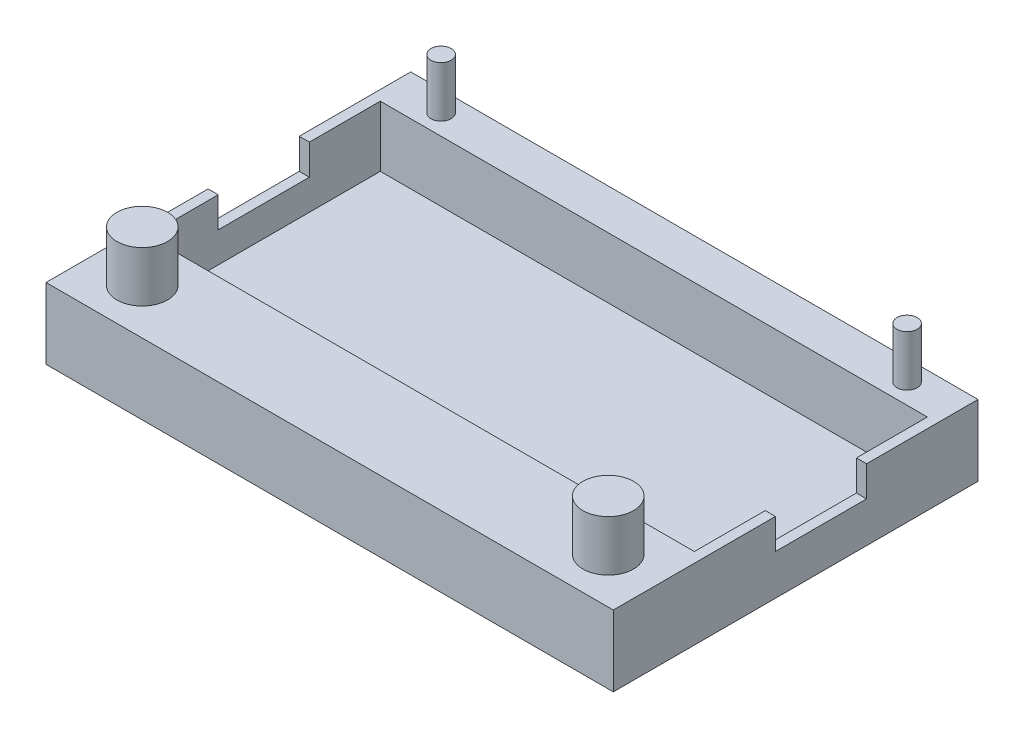
ISO-10303-21;
HEADER;
FILE_DESCRIPTION(('STEP AP214'),'2;1');
FILE_NAME('part.step','',(''),(''),'','','');
FILE_SCHEMA(('AUTOMOTIVE_DESIGN { 1 0 10303 214 1 1 1 1 }'));
ENDSEC;
DATA;
#1=APPLICATION_CONTEXT('core data for automotive mechanical design processes');
#2=APPLICATION_PROTOCOL_DEFINITION('international standard','automotive_design',2000,#1);
#3=PRODUCT_CONTEXT('',#1,'mechanical');
#4=PRODUCT('Part','Part','',(#3));
#5=PRODUCT_RELATED_PRODUCT_CATEGORY('part','',(#4));
#6=PRODUCT_DEFINITION_FORMATION('','',#4);
#7=PRODUCT_DEFINITION_CONTEXT('part definition',#1,'design');
#8=PRODUCT_DEFINITION('design','',#6,#7);
#9=PRODUCT_DEFINITION_SHAPE('','',#8);
#10=(LENGTH_UNIT() NAMED_UNIT(*) SI_UNIT(.MILLI.,.METRE.));
#11=(NAMED_UNIT(*) PLANE_ANGLE_UNIT() SI_UNIT($,.RADIAN.));
#12=(NAMED_UNIT(*) SI_UNIT($,.STERADIAN.) SOLID_ANGLE_UNIT());
#13=UNCERTAINTY_MEASURE_WITH_UNIT(LENGTH_MEASURE(1.E-05),#10,'distance_accuracy_value','');
#14=(GEOMETRIC_REPRESENTATION_CONTEXT(3) GLOBAL_UNCERTAINTY_ASSIGNED_CONTEXT((#13)) GLOBAL_UNIT_ASSIGNED_CONTEXT((#10,
#11,#12)) REPRESENTATION_CONTEXT('',''));
#15=CARTESIAN_POINT('',(0.,0.,0.));
#16=DIRECTION('',(0.,0.,1.));
#17=DIRECTION('',(1.,0.,0.));
#18=AXIS2_PLACEMENT_3D('',#15,#16,#17);
#19=CARTESIAN_POINT('',(0.,4.,0.));
#20=DIRECTION('',(0.,1.,0.));
#21=DIRECTION('',(0.,0.,1.));
#22=AXIS2_PLACEMENT_3D('',#19,#20,#21);
#23=PLANE('',#22);
#24=DIRECTION('',(0.,0.,-1.));
#25=VECTOR('',#24,1.);
#26=CARTESIAN_POINT('',(0.,4.,-32.));
#27=LINE('',#26,#25);
#28=CARTESIAN_POINT('',(0.,4.,-15.));
#29=VERTEX_POINT('',#28);
#30=CARTESIAN_POINT('',(0.,4.,-24.));
#31=VERTEX_POINT('',#30);
#32=EDGE_CURVE('E279',#29,#31,#27,.T.);
#33=ORIENTED_EDGE('',*,*,#32,.T.);
#34=DIRECTION('',(1.,0.,0.));
#35=VECTOR('',#34,1.);
#36=CARTESIAN_POINT('',(0.,4.,-24.));
#37=LINE('',#36,#35);
#38=CARTESIAN_POINT('',(-1.,4.,-24.));
#39=VERTEX_POINT('',#38);
#40=EDGE_CURVE('E196',#39,#31,#37,.T.);
#41=ORIENTED_EDGE('',*,*,#40,.F.);
#42=DIRECTION('',(0.,0.,-1.));
#43=VECTOR('',#42,1.);
#44=CARTESIAN_POINT('',(-1.,4.,-31.));
#45=LINE('',#44,#43);
#46=CARTESIAN_POINT('',(-1.,4.,-15.));
#47=VERTEX_POINT('',#46);
#48=EDGE_CURVE('E255',#47,#39,#45,.T.);
#49=ORIENTED_EDGE('',*,*,#48,.F.);
#50=DIRECTION('',(-1.,0.,0.));
#51=VECTOR('',#50,1.);
#52=CARTESIAN_POINT('',(0.,4.,-15.));
#53=LINE('',#52,#51);
#54=EDGE_CURVE('E64',#29,#47,#53,.T.);
#55=ORIENTED_EDGE('',*,*,#54,.F.);
#56=EDGE_LOOP('',(#33,#41,#49,#55));
#57=FACE_BOUND('',#56,.T.);
#58=ADVANCED_FACE('F41',(#57),#23,.T.);
#59=DIRECTION('',(0.,0.,1.));
#60=VECTOR('',#59,1.);
#61=CARTESIAN_POINT('',(-55.,4.,-31.));
#62=LINE('',#61,#60);
#63=CARTESIAN_POINT('',(-55.,4.,-24.));
#64=VERTEX_POINT('',#63);
#65=CARTESIAN_POINT('',(-55.,4.,-15.));
#66=VERTEX_POINT('',#65);
#67=EDGE_CURVE('E56',#64,#66,#62,.T.);
#68=ORIENTED_EDGE('',*,*,#67,.F.);
#69=DIRECTION('',(1.,0.,0.));
#70=VECTOR('',#69,1.);
#71=CARTESIAN_POINT('',(0.,4.,-24.));
#72=LINE('',#71,#70);
#73=CARTESIAN_POINT('',(-56.,4.,-24.));
#74=VERTEX_POINT('',#73);
#75=EDGE_CURVE('E201',#74,#64,#72,.T.);
#76=ORIENTED_EDGE('',*,*,#75,.F.);
#77=DIRECTION('',(0.,0.,1.));
#78=VECTOR('',#77,1.);
#79=CARTESIAN_POINT('',(-56.,4.,-32.));
#80=LINE('',#79,#78);
#81=CARTESIAN_POINT('',(-56.,4.,-15.));
#82=VERTEX_POINT('',#81);
#83=EDGE_CURVE('E277',#74,#82,#80,.T.);
#84=ORIENTED_EDGE('',*,*,#83,.T.);
#85=DIRECTION('',(-1.,0.,0.));
#86=VECTOR('',#85,1.);
#87=CARTESIAN_POINT('',(0.,4.,-15.));
#88=LINE('',#87,#86);
#89=EDGE_CURVE('E229',#66,#82,#88,.T.);
#90=ORIENTED_EDGE('',*,*,#89,.F.);
#91=EDGE_LOOP('',(#68,#76,#84,#90));
#92=FACE_BOUND('',#91,.T.);
#93=ADVANCED_FACE('F351',(#92),#23,.T.);
#94=CARTESIAN_POINT('',(-56.,1.,-32.));
#95=DIRECTION('',(1.,0.,0.));
#96=DIRECTION('',(0.,0.,-1.));
#97=AXIS2_PLACEMENT_3D('',#94,#95,#96);
#98=PLANE('',#97);
#99=DIRECTION('',(0.,0.,1.));
#100=VECTOR('',#99,1.);
#101=CARTESIAN_POINT('',(-56.,0.,-32.));
#102=LINE('',#101,#100);
#103=CARTESIAN_POINT('',(-56.,0.,-35.));
#104=VERTEX_POINT('',#103);
#105=CARTESIAN_POINT('',(-56.,0.,1.));
#106=VERTEX_POINT('',#105);
#107=EDGE_CURVE('E49',#104,#106,#102,.T.);
#108=ORIENTED_EDGE('',*,*,#107,.T.);
#109=DIRECTION('',(0.,-1.,0.));
#110=VECTOR('',#109,1.);
#111=CARTESIAN_POINT('',(-56.,7.,1.));
#112=LINE('',#111,#110);
#113=CARTESIAN_POINT('',(-56.,7.,1.));
#114=VERTEX_POINT('',#113);
#115=EDGE_CURVE('E174',#114,#106,#112,.T.);
#116=ORIENTED_EDGE('',*,*,#115,.F.);
#117=DIRECTION('',(0.,0.,-1.));
#118=VECTOR('',#117,1.);
#119=CARTESIAN_POINT('',(-56.,7.,0.));
#120=LINE('',#119,#118);
#121=CARTESIAN_POINT('',(-56.,7.,-15.));
#122=VERTEX_POINT('',#121);
#123=EDGE_CURVE('E156',#114,#122,#120,.T.);
#124=ORIENTED_EDGE('',*,*,#123,.T.);
#125=DIRECTION('',(0.,-1.,0.));
#126=VECTOR('',#125,1.);
#127=CARTESIAN_POINT('',(-56.,7.,-15.));
#128=LINE('',#127,#126);
#129=EDGE_CURVE('E168',#122,#82,#128,.T.);
#130=ORIENTED_EDGE('',*,*,#129,.T.);
#131=ORIENTED_EDGE('',*,*,#83,.F.);
#132=DIRECTION('',(0.,-1.,0.));
#133=VECTOR('',#132,1.);
#134=CARTESIAN_POINT('',(-56.,7.,-24.));
#135=LINE('',#134,#133);
#136=CARTESIAN_POINT('',(-56.,7.,-24.));
#137=VERTEX_POINT('',#136);
#138=EDGE_CURVE('E219',#137,#74,#135,.T.);
#139=ORIENTED_EDGE('',*,*,#138,.F.);
#140=DIRECTION('',(0.,0.,-1.));
#141=VECTOR('',#140,1.);
#142=CARTESIAN_POINT('',(-56.,7.,0.));
#143=LINE('',#142,#141);
#144=CARTESIAN_POINT('',(-56.,7.,-35.));
#145=VERTEX_POINT('',#144);
#146=EDGE_CURVE('E205',#137,#145,#143,.T.);
#147=ORIENTED_EDGE('',*,*,#146,.T.);
#148=DIRECTION('',(0.,-1.,0.));
#149=VECTOR('',#148,1.);
#150=CARTESIAN_POINT('',(-56.,7.,-35.));
#151=LINE('',#150,#149);
#152=EDGE_CURVE('E190',#145,#104,#151,.T.);
#153=ORIENTED_EDGE('',*,*,#152,.T.);
#154=EDGE_LOOP('',(#108,#116,#124,#130,#131,#139,#147,#153));
#155=FACE_BOUND('',#154,.T.);
#156=ADVANCED_FACE('F43',(#155),#98,.F.);
#157=CARTESIAN_POINT('',(0.,1.,-32.));
#158=DIRECTION('',(-1.,0.,0.));
#159=DIRECTION('',(0.,0.,1.));
#160=AXIS2_PLACEMENT_3D('',#157,#158,#159);
#161=PLANE('',#160);
#162=DIRECTION('',(0.,0.,-1.));
#163=VECTOR('',#162,1.);
#164=CARTESIAN_POINT('',(0.,0.,-32.));
#165=LINE('',#164,#163);
#166=CARTESIAN_POINT('',(0.,0.,1.));
#167=VERTEX_POINT('',#166);
#168=CARTESIAN_POINT('',(0.,0.,-35.));
#169=VERTEX_POINT('',#168);
#170=EDGE_CURVE('E11',#167,#169,#165,.T.);
#171=ORIENTED_EDGE('',*,*,#170,.T.);
#172=DIRECTION('',(0.,-1.,0.));
#173=VECTOR('',#172,1.);
#174=CARTESIAN_POINT('',(0.,7.,-35.));
#175=LINE('',#174,#173);
#176=CARTESIAN_POINT('',(0.,7.,-35.));
#177=VERTEX_POINT('',#176);
#178=EDGE_CURVE('E193',#177,#169,#175,.T.);
#179=ORIENTED_EDGE('',*,*,#178,.F.);
#180=DIRECTION('',(0.,0.,-1.));
#181=VECTOR('',#180,1.);
#182=CARTESIAN_POINT('',(0.,7.,0.));
#183=LINE('',#182,#181);
#184=CARTESIAN_POINT('',(0.,7.,-24.));
#185=VERTEX_POINT('',#184);
#186=EDGE_CURVE('E203',#185,#177,#183,.T.);
#187=ORIENTED_EDGE('',*,*,#186,.F.);
#188=DIRECTION('',(0.,-1.,0.));
#189=VECTOR('',#188,1.);
#190=CARTESIAN_POINT('',(0.,7.,-24.));
#191=LINE('',#190,#189);
#192=EDGE_CURVE('E221',#185,#31,#191,.T.);
#193=ORIENTED_EDGE('',*,*,#192,.T.);
#194=ORIENTED_EDGE('',*,*,#32,.F.);
#195=DIRECTION('',(0.,-1.,0.));
#196=VECTOR('',#195,1.);
#197=CARTESIAN_POINT('',(0.,7.,-15.));
#198=LINE('',#197,#196);
#199=CARTESIAN_POINT('',(0.,7.,-15.));
#200=VERTEX_POINT('',#199);
#201=EDGE_CURVE('E250',#200,#29,#198,.T.);
#202=ORIENTED_EDGE('',*,*,#201,.F.);
#203=DIRECTION('',(0.,0.,-1.));
#204=VECTOR('',#203,1.);
#205=CARTESIAN_POINT('',(0.,7.,0.));
#206=LINE('',#205,#204);
#207=CARTESIAN_POINT('',(0.,7.,1.));
#208=VERTEX_POINT('',#207);
#209=EDGE_CURVE('E226',#208,#200,#206,.T.);
#210=ORIENTED_EDGE('',*,*,#209,.F.);
#211=DIRECTION('',(0.,-1.,0.));
#212=VECTOR('',#211,1.);
#213=CARTESIAN_POINT('',(0.,7.,1.));
#214=LINE('',#213,#212);
#215=EDGE_CURVE('E176',#208,#167,#214,.T.);
#216=ORIENTED_EDGE('',*,*,#215,.T.);
#217=EDGE_LOOP('',(#171,#179,#187,#193,#194,#202,#210,#216));
#218=FACE_BOUND('',#217,.T.);
#219=ADVANCED_FACE('F283',(#218),#161,.F.);
#220=CARTESIAN_POINT('',(0.,0.,0.));
#221=DIRECTION('',(0.,1.,0.));
#222=DIRECTION('',(0.,0.,1.));
#223=AXIS2_PLACEMENT_3D('',#220,#221,#222);
#224=PLANE('',#223);
#225=ORIENTED_EDGE('',*,*,#107,.F.);
#226=DIRECTION('',(-1.,0.,0.));
#227=VECTOR('',#226,1.);
#228=CARTESIAN_POINT('',(-56.,0.,-35.));
#229=LINE('',#228,#227);
#230=EDGE_CURVE('E181',#169,#104,#229,.T.);
#231=ORIENTED_EDGE('',*,*,#230,.F.);
#232=ORIENTED_EDGE('',*,*,#170,.F.);
#233=DIRECTION('',(1.,0.,0.));
#234=VECTOR('',#233,1.);
#235=CARTESIAN_POINT('',(-56.,0.,1.));
#236=LINE('',#235,#234);
#237=EDGE_CURVE('E177',#106,#167,#236,.T.);
#238=ORIENTED_EDGE('',*,*,#237,.F.);
#239=EDGE_LOOP('',(#225,#231,#232,#238));
#240=FACE_BOUND('',#239,.T.);
#241=ADVANCED_FACE('F297',(#240),#224,.F.);
#242=CARTESIAN_POINT('',(-55.,4.,-31.));
#243=DIRECTION('',(1.,0.,0.));
#244=DIRECTION('',(0.,0.,-1.));
#245=AXIS2_PLACEMENT_3D('',#242,#243,#244);
#246=PLANE('',#245);
#247=DIRECTION('',(0.,0.,1.));
#248=VECTOR('',#247,1.);
#249=CARTESIAN_POINT('',(-55.,1.,-31.));
#250=LINE('',#249,#248);
#251=CARTESIAN_POINT('',(-55.,1.,-31.));
#252=VERTEX_POINT('',#251);
#253=CARTESIAN_POINT('',(-55.,1.,-8.));
#254=VERTEX_POINT('',#253);
#255=EDGE_CURVE('E253',#252,#254,#250,.T.);
#256=ORIENTED_EDGE('',*,*,#255,.F.);
#257=DIRECTION('',(0.,-1.,0.));
#258=VECTOR('',#257,1.);
#259=CARTESIAN_POINT('',(-55.,4.,-31.));
#260=LINE('',#259,#258);
#261=CARTESIAN_POINT('',(-55.,7.,-31.));
#262=VERTEX_POINT('',#261);
#263=EDGE_CURVE('E259',#262,#252,#260,.T.);
#264=ORIENTED_EDGE('',*,*,#263,.F.);
#265=DIRECTION('',(0.,0.,-1.));
#266=VECTOR('',#265,1.);
#267=CARTESIAN_POINT('',(-55.,7.,0.));
#268=LINE('',#267,#266);
#269=CARTESIAN_POINT('',(-55.,7.,-24.));
#270=VERTEX_POINT('',#269);
#271=EDGE_CURVE('E209',#270,#262,#268,.T.);
#272=ORIENTED_EDGE('',*,*,#271,.F.);
#273=DIRECTION('',(0.,-1.,0.));
#274=VECTOR('',#273,1.);
#275=CARTESIAN_POINT('',(-55.,7.,-24.));
#276=LINE('',#275,#274);
#277=EDGE_CURVE('E215',#270,#64,#276,.T.);
#278=ORIENTED_EDGE('',*,*,#277,.T.);
#279=ORIENTED_EDGE('',*,*,#67,.T.);
#280=DIRECTION('',(0.,-1.,0.));
#281=VECTOR('',#280,1.);
#282=CARTESIAN_POINT('',(-55.,7.,-15.));
#283=LINE('',#282,#281);
#284=CARTESIAN_POINT('',(-55.,7.,-15.));
#285=VERTEX_POINT('',#284);
#286=EDGE_CURVE('E244',#285,#66,#283,.T.);
#287=ORIENTED_EDGE('',*,*,#286,.F.);
#288=DIRECTION('',(0.,0.,-1.));
#289=VECTOR('',#288,1.);
#290=CARTESIAN_POINT('',(-55.,7.,0.));
#291=LINE('',#290,#289);
#292=CARTESIAN_POINT('',(-55.,7.,-8.));
#293=VERTEX_POINT('',#292);
#294=EDGE_CURVE('E237',#293,#285,#291,.T.);
#295=ORIENTED_EDGE('',*,*,#294,.F.);
#296=DIRECTION('',(0.,-1.,0.));
#297=VECTOR('',#296,1.);
#298=CARTESIAN_POINT('',(-55.,4.,-8.));
#299=LINE('',#298,#297);
#300=EDGE_CURVE('E274',#293,#254,#299,.T.);
#301=ORIENTED_EDGE('',*,*,#300,.T.);
#302=EDGE_LOOP('',(#256,#264,#272,#278,#279,#287,#295,#301));
#303=FACE_BOUND('',#302,.T.);
#304=ADVANCED_FACE('F359',(#303),#246,.T.);
#305=CARTESIAN_POINT('',(-55.,4.,-8.));
#306=DIRECTION('',(0.,0.,-1.));
#307=DIRECTION('',(-1.,0.,0.));
#308=AXIS2_PLACEMENT_3D('',#305,#306,#307);
#309=PLANE('',#308);
#310=DIRECTION('',(1.,0.,0.));
#311=VECTOR('',#310,1.);
#312=CARTESIAN_POINT('',(-55.,1.,-8.));
#313=LINE('',#312,#311);
#314=CARTESIAN_POINT('',(-1.,1.,-8.));
#315=VERTEX_POINT('',#314);
#316=EDGE_CURVE('E261',#254,#315,#313,.T.);
#317=ORIENTED_EDGE('',*,*,#316,.F.);
#318=ORIENTED_EDGE('',*,*,#300,.F.);
#319=DIRECTION('',(1.,0.,0.));
#320=VECTOR('',#319,1.);
#321=CARTESIAN_POINT('',(0.,7.,-8.));
#322=LINE('',#321,#320);
#323=CARTESIAN_POINT('',(-1.,7.,-8.));
#324=VERTEX_POINT('',#323);
#325=EDGE_CURVE('E234',#293,#324,#322,.T.);
#326=ORIENTED_EDGE('',*,*,#325,.T.);
#327=DIRECTION('',(0.,-1.,0.));
#328=VECTOR('',#327,1.);
#329=CARTESIAN_POINT('',(-1.,4.,-8.));
#330=LINE('',#329,#328);
#331=EDGE_CURVE('E271',#324,#315,#330,.T.);
#332=ORIENTED_EDGE('',*,*,#331,.T.);
#333=EDGE_LOOP('',(#317,#318,#326,#332));
#334=FACE_BOUND('',#333,.T.);
#335=ADVANCED_FACE('F391',(#334),#309,.T.);
#336=CARTESIAN_POINT('',(-1.,4.,-31.));
#337=DIRECTION('',(-1.,0.,0.));
#338=DIRECTION('',(0.,0.,1.));
#339=AXIS2_PLACEMENT_3D('',#336,#337,#338);
#340=PLANE('',#339);
#341=DIRECTION('',(0.,0.,-1.));
#342=VECTOR('',#341,1.);
#343=CARTESIAN_POINT('',(-1.,1.,-31.));
#344=LINE('',#343,#342);
#345=CARTESIAN_POINT('',(-1.,1.,-31.));
#346=VERTEX_POINT('',#345);
#347=EDGE_CURVE('E263',#315,#346,#344,.T.);
#348=ORIENTED_EDGE('',*,*,#347,.F.);
#349=ORIENTED_EDGE('',*,*,#331,.F.);
#350=DIRECTION('',(0.,0.,-1.));
#351=VECTOR('',#350,1.);
#352=CARTESIAN_POINT('',(-1.,7.,0.));
#353=LINE('',#352,#351);
#354=CARTESIAN_POINT('',(-1.,7.,-15.));
#355=VERTEX_POINT('',#354);
#356=EDGE_CURVE('E231',#324,#355,#353,.T.);
#357=ORIENTED_EDGE('',*,*,#356,.T.);
#358=DIRECTION('',(0.,-1.,0.));
#359=VECTOR('',#358,1.);
#360=CARTESIAN_POINT('',(-1.,7.,-15.));
#361=LINE('',#360,#359);
#362=EDGE_CURVE('E247',#355,#47,#361,.T.);
#363=ORIENTED_EDGE('',*,*,#362,.T.);
#364=ORIENTED_EDGE('',*,*,#48,.T.);
#365=DIRECTION('',(0.,-1.,0.));
#366=VECTOR('',#365,1.);
#367=CARTESIAN_POINT('',(-1.,7.,-24.));
#368=LINE('',#367,#366);
#369=CARTESIAN_POINT('',(-1.,7.,-24.));
#370=VERTEX_POINT('',#369);
#371=EDGE_CURVE('E224',#370,#39,#368,.T.);
#372=ORIENTED_EDGE('',*,*,#371,.F.);
#373=DIRECTION('',(0.,0.,-1.));
#374=VECTOR('',#373,1.);
#375=CARTESIAN_POINT('',(-1.,7.,0.));
#376=LINE('',#375,#374);
#377=CARTESIAN_POINT('',(-1.,7.,-31.));
#378=VERTEX_POINT('',#377);
#379=EDGE_CURVE('E197',#370,#378,#376,.T.);
#380=ORIENTED_EDGE('',*,*,#379,.T.);
#381=DIRECTION('',(0.,-1.,0.));
#382=VECTOR('',#381,1.);
#383=CARTESIAN_POINT('',(-1.,4.,-31.));
#384=LINE('',#383,#382);
#385=EDGE_CURVE('E268',#378,#346,#384,.T.);
#386=ORIENTED_EDGE('',*,*,#385,.T.);
#387=EDGE_LOOP('',(#348,#349,#357,#363,#364,#372,#380,#386));
#388=FACE_BOUND('',#387,.T.);
#389=ADVANCED_FACE('F400',(#388),#340,.T.);
#390=CARTESIAN_POINT('',(-55.,4.,-31.));
#391=DIRECTION('',(0.,0.,1.));
#392=DIRECTION('',(1.,0.,0.));
#393=AXIS2_PLACEMENT_3D('',#390,#391,#392);
#394=PLANE('',#393);
#395=DIRECTION('',(-1.,0.,0.));
#396=VECTOR('',#395,1.);
#397=CARTESIAN_POINT('',(-55.,1.,-31.));
#398=LINE('',#397,#396);
#399=EDGE_CURVE('E256',#346,#252,#398,.T.);
#400=ORIENTED_EDGE('',*,*,#399,.F.);
#401=ORIENTED_EDGE('',*,*,#385,.F.);
#402=DIRECTION('',(1.,0.,0.));
#403=VECTOR('',#402,1.);
#404=CARTESIAN_POINT('',(0.,7.,-31.));
#405=LINE('',#404,#403);
#406=EDGE_CURVE('E212',#262,#378,#405,.T.);
#407=ORIENTED_EDGE('',*,*,#406,.F.);
#408=ORIENTED_EDGE('',*,*,#263,.T.);
#409=EDGE_LOOP('',(#400,#401,#407,#408));
#410=FACE_BOUND('',#409,.T.);
#411=ADVANCED_FACE('F364',(#410),#394,.T.);
#412=CARTESIAN_POINT('',(0.,1.,0.));
#413=DIRECTION('',(0.,1.,0.));
#414=DIRECTION('',(0.,0.,1.));
#415=AXIS2_PLACEMENT_3D('',#412,#413,#414);
#416=PLANE('',#415);
#417=ORIENTED_EDGE('',*,*,#255,.T.);
#418=ORIENTED_EDGE('',*,*,#316,.T.);
#419=ORIENTED_EDGE('',*,*,#347,.T.);
#420=ORIENTED_EDGE('',*,*,#399,.T.);
#421=EDGE_LOOP('',(#417,#418,#419,#420));
#422=FACE_BOUND('',#421,.T.);
#423=ADVANCED_FACE('F361',(#422),#416,.T.);
#424=CARTESIAN_POINT('',(0.,7.,-15.));
#425=DIRECTION('',(0.,0.,1.));
#426=DIRECTION('',(1.,0.,0.));
#427=AXIS2_PLACEMENT_3D('',#424,#425,#426);
#428=PLANE('',#427);
#429=ORIENTED_EDGE('',*,*,#54,.T.);
#430=ORIENTED_EDGE('',*,*,#362,.F.);
#431=DIRECTION('',(-1.,0.,0.));
#432=VECTOR('',#431,1.);
#433=CARTESIAN_POINT('',(0.,7.,-15.));
#434=LINE('',#433,#432);
#435=EDGE_CURVE('E228',#200,#355,#434,.T.);
#436=ORIENTED_EDGE('',*,*,#435,.F.);
#437=ORIENTED_EDGE('',*,*,#201,.T.);
#438=EDGE_LOOP('',(#429,#430,#436,#437));
#439=FACE_BOUND('',#438,.T.);
#440=ADVANCED_FACE('F287',(#439),#428,.F.);
#441=CARTESIAN_POINT('',(0.,7.,-15.));
#442=DIRECTION('',(0.,0.,1.));
#443=DIRECTION('',(1.,0.,0.));
#444=AXIS2_PLACEMENT_3D('',#441,#442,#443);
#445=PLANE('',#444);
#446=ORIENTED_EDGE('',*,*,#89,.T.);
#447=ORIENTED_EDGE('',*,*,#129,.F.);
#448=DIRECTION('',(-1.,0.,0.));
#449=VECTOR('',#448,1.);
#450=CARTESIAN_POINT('',(0.,7.,-15.));
#451=LINE('',#450,#449);
#452=EDGE_CURVE('E163',#285,#122,#451,.T.);
#453=ORIENTED_EDGE('',*,*,#452,.F.);
#454=ORIENTED_EDGE('',*,*,#286,.T.);
#455=EDGE_LOOP('',(#446,#447,#453,#454));
#456=FACE_BOUND('',#455,.T.);
#457=ADVANCED_FACE('F329',(#456),#445,.F.);
#458=CARTESIAN_POINT('',(0.,7.,0.));
#459=DIRECTION('',(0.,1.,0.));
#460=DIRECTION('',(0.,0.,1.));
#461=AXIS2_PLACEMENT_3D('',#458,#459,#460);
#462=PLANE('',#461);
#463=CARTESIAN_POINT('',(-5.,7.,-3.5));
#464=DIRECTION('',(0.,1.,0.));
#465=DIRECTION('',(0.,0.,1.));
#466=AXIS2_PLACEMENT_3D('',#463,#464,#465);
#467=CIRCLE('',#466,2.5);
#468=CARTESIAN_POINT('',(-5.,7.,-0.999999999999999));
#469=VERTEX_POINT('',#468);
#470=EDGE_CURVE('E315',#469,#469,#467,.T.);
#471=ORIENTED_EDGE('',*,*,#470,.F.);
#472=EDGE_LOOP('',(#471));
#473=FACE_BOUND('',#472,.T.);
#474=CARTESIAN_POINT('',(-51.,7.,-3.5));
#475=DIRECTION('',(0.,1.,0.));
#476=DIRECTION('',(0.,0.,1.));
#477=AXIS2_PLACEMENT_3D('',#474,#475,#476);
#478=CIRCLE('',#477,2.5);
#479=CARTESIAN_POINT('',(-51.,7.,-0.999999999999997));
#480=VERTEX_POINT('',#479);
#481=EDGE_CURVE('E309',#480,#480,#478,.T.);
#482=ORIENTED_EDGE('',*,*,#481,.F.);
#483=EDGE_LOOP('',(#482));
#484=FACE_BOUND('',#483,.T.);
#485=ORIENTED_EDGE('',*,*,#209,.T.);
#486=ORIENTED_EDGE('',*,*,#435,.T.);
#487=ORIENTED_EDGE('',*,*,#356,.F.);
#488=ORIENTED_EDGE('',*,*,#325,.F.);
#489=ORIENTED_EDGE('',*,*,#294,.T.);
#490=ORIENTED_EDGE('',*,*,#452,.T.);
#491=ORIENTED_EDGE('',*,*,#123,.F.);
#492=DIRECTION('',(1.,0.,0.));
#493=VECTOR('',#492,1.);
#494=CARTESIAN_POINT('',(-56.,7.,1.));
#495=LINE('',#494,#493);
#496=EDGE_CURVE('E160',#114,#208,#495,.T.);
#497=ORIENTED_EDGE('',*,*,#496,.T.);
#498=EDGE_LOOP('',(#485,#486,#487,#488,#489,#490,#491,#497));
#499=FACE_BOUND('',#498,.T.);
#500=ADVANCED_FACE('F159',(#473,#484,#499),#462,.T.);
#501=CARTESIAN_POINT('',(0.,7.,-24.));
#502=DIRECTION('',(0.,0.,-1.));
#503=DIRECTION('',(-1.,0.,0.));
#504=AXIS2_PLACEMENT_3D('',#501,#502,#503);
#505=PLANE('',#504);
#506=ORIENTED_EDGE('',*,*,#40,.T.);
#507=ORIENTED_EDGE('',*,*,#192,.F.);
#508=DIRECTION('',(1.,0.,0.));
#509=VECTOR('',#508,1.);
#510=CARTESIAN_POINT('',(0.,7.,-24.));
#511=LINE('',#510,#509);
#512=EDGE_CURVE('E200',#370,#185,#511,.T.);
#513=ORIENTED_EDGE('',*,*,#512,.F.);
#514=ORIENTED_EDGE('',*,*,#371,.T.);
#515=EDGE_LOOP('',(#506,#507,#513,#514));
#516=FACE_BOUND('',#515,.T.);
#517=ADVANCED_FACE('F328',(#516),#505,.F.);
#518=CARTESIAN_POINT('',(0.,7.,-24.));
#519=DIRECTION('',(0.,0.,-1.));
#520=DIRECTION('',(-1.,0.,0.));
#521=AXIS2_PLACEMENT_3D('',#518,#519,#520);
#522=PLANE('',#521);
#523=ORIENTED_EDGE('',*,*,#75,.T.);
#524=ORIENTED_EDGE('',*,*,#277,.F.);
#525=DIRECTION('',(1.,0.,0.));
#526=VECTOR('',#525,1.);
#527=CARTESIAN_POINT('',(0.,7.,-24.));
#528=LINE('',#527,#526);
#529=EDGE_CURVE('E207',#137,#270,#528,.T.);
#530=ORIENTED_EDGE('',*,*,#529,.F.);
#531=ORIENTED_EDGE('',*,*,#138,.T.);
#532=EDGE_LOOP('',(#523,#524,#530,#531));
#533=FACE_BOUND('',#532,.T.);
#534=ADVANCED_FACE('F450',(#533),#522,.F.);
#535=CARTESIAN_POINT('',(0.,7.,0.));
#536=DIRECTION('',(0.,1.,0.));
#537=DIRECTION('',(0.,0.,1.));
#538=AXIS2_PLACEMENT_3D('',#535,#536,#537);
#539=PLANE('',#538);
#540=CARTESIAN_POINT('',(-5.,7.,-33.));
#541=DIRECTION('',(0.,1.,0.));
#542=DIRECTION('',(0.,0.,1.));
#543=AXIS2_PLACEMENT_3D('',#540,#541,#542);
#544=CIRCLE('',#543,1.);
#545=CARTESIAN_POINT('',(-5.,7.,-32.));
#546=VERTEX_POINT('',#545);
#547=EDGE_CURVE('E304',#546,#546,#544,.T.);
#548=ORIENTED_EDGE('',*,*,#547,.F.);
#549=EDGE_LOOP('',(#548));
#550=FACE_BOUND('',#549,.T.);
#551=CARTESIAN_POINT('',(-51.,7.,-33.));
#552=DIRECTION('',(0.,1.,0.));
#553=DIRECTION('',(0.,0.,1.));
#554=AXIS2_PLACEMENT_3D('',#551,#552,#553);
#555=CIRCLE('',#554,0.999999999999998);
#556=CARTESIAN_POINT('',(-51.,7.,-32.));
#557=VERTEX_POINT('',#556);
#558=EDGE_CURVE('E300',#557,#557,#555,.T.);
#559=ORIENTED_EDGE('',*,*,#558,.F.);
#560=EDGE_LOOP('',(#559));
#561=FACE_BOUND('',#560,.T.);
#562=ORIENTED_EDGE('',*,*,#379,.F.);
#563=ORIENTED_EDGE('',*,*,#512,.T.);
#564=ORIENTED_EDGE('',*,*,#186,.T.);
#565=DIRECTION('',(-1.,0.,0.));
#566=VECTOR('',#565,1.);
#567=CARTESIAN_POINT('',(-56.,7.,-35.));
#568=LINE('',#567,#566);
#569=EDGE_CURVE('E184',#177,#145,#568,.T.);
#570=ORIENTED_EDGE('',*,*,#569,.T.);
#571=ORIENTED_EDGE('',*,*,#146,.F.);
#572=ORIENTED_EDGE('',*,*,#529,.T.);
#573=ORIENTED_EDGE('',*,*,#271,.T.);
#574=ORIENTED_EDGE('',*,*,#406,.T.);
#575=EDGE_LOOP('',(#562,#563,#564,#570,#571,#572,#573,#574));
#576=FACE_BOUND('',#575,.T.);
#577=ADVANCED_FACE('F461',(#550,#561,#576),#539,.T.);
#578=CARTESIAN_POINT('',(-56.,7.,-35.));
#579=DIRECTION('',(0.,0.,1.));
#580=DIRECTION('',(1.,0.,0.));
#581=AXIS2_PLACEMENT_3D('',#578,#579,#580);
#582=PLANE('',#581);
#583=ORIENTED_EDGE('',*,*,#230,.T.);
#584=ORIENTED_EDGE('',*,*,#152,.F.);
#585=ORIENTED_EDGE('',*,*,#569,.F.);
#586=ORIENTED_EDGE('',*,*,#178,.T.);
#587=EDGE_LOOP('',(#583,#584,#585,#586));
#588=FACE_BOUND('',#587,.T.);
#589=ADVANCED_FACE('F295',(#588),#582,.F.);
#590=CARTESIAN_POINT('',(-56.,7.,1.));
#591=DIRECTION('',(0.,0.,-1.));
#592=DIRECTION('',(-1.,0.,0.));
#593=AXIS2_PLACEMENT_3D('',#590,#591,#592);
#594=PLANE('',#593);
#595=ORIENTED_EDGE('',*,*,#237,.T.);
#596=ORIENTED_EDGE('',*,*,#215,.F.);
#597=ORIENTED_EDGE('',*,*,#496,.F.);
#598=ORIENTED_EDGE('',*,*,#115,.T.);
#599=EDGE_LOOP('',(#595,#596,#597,#598));
#600=FACE_BOUND('',#599,.T.);
#601=ADVANCED_FACE('F173',(#600),#594,.F.);
#602=CARTESIAN_POINT('',(-51.,12.,-33.));
#603=DIRECTION('',(0.,-1.,0.));
#604=DIRECTION('',(0.,0.,-1.));
#605=AXIS2_PLACEMENT_3D('',#602,#603,#604);
#606=CYLINDRICAL_SURFACE('',#605,0.999999999999998);
#607=CARTESIAN_POINT('',(-51.,12.,-33.));
#608=DIRECTION('',(0.,1.,0.));
#609=DIRECTION('',(0.,0.,1.));
#610=AXIS2_PLACEMENT_3D('',#607,#608,#609);
#611=CIRCLE('',#610,0.999999999999998);
#612=CARTESIAN_POINT('',(-51.,12.,-32.));
#613=VERTEX_POINT('',#612);
#614=EDGE_CURVE('E298',#613,#613,#611,.T.);
#615=ORIENTED_EDGE('',*,*,#614,.F.);
#616=EDGE_LOOP('',(#615));
#617=FACE_BOUND('',#616,.T.);
#618=ORIENTED_EDGE('',*,*,#558,.T.);
#619=EDGE_LOOP('',(#618));
#620=FACE_BOUND('',#619,.T.);
#621=ADVANCED_FACE('F485',(#617,#620),#606,.T.);
#622=CARTESIAN_POINT('',(-51.,12.,-33.));
#623=DIRECTION('',(0.,1.,0.));
#624=DIRECTION('',(0.,0.,1.));
#625=AXIS2_PLACEMENT_3D('',#622,#623,#624);
#626=PLANE('',#625);
#627=ORIENTED_EDGE('',*,*,#614,.T.);
#628=EDGE_LOOP('',(#627));
#629=FACE_BOUND('',#628,.T.);
#630=ADVANCED_FACE('F494',(#629),#626,.T.);
#631=CARTESIAN_POINT('',(-5.,12.,-33.));
#632=DIRECTION('',(0.,-1.,0.));
#633=DIRECTION('',(0.,0.,-1.));
#634=AXIS2_PLACEMENT_3D('',#631,#632,#633);
#635=CYLINDRICAL_SURFACE('',#634,1.);
#636=CARTESIAN_POINT('',(-5.,12.,-33.));
#637=DIRECTION('',(0.,1.,0.));
#638=DIRECTION('',(0.,0.,1.));
#639=AXIS2_PLACEMENT_3D('',#636,#637,#638);
#640=CIRCLE('',#639,1.);
#641=CARTESIAN_POINT('',(-5.,12.,-32.));
#642=VERTEX_POINT('',#641);
#643=EDGE_CURVE('E306',#642,#642,#640,.T.);
#644=ORIENTED_EDGE('',*,*,#643,.F.);
#645=EDGE_LOOP('',(#644));
#646=FACE_BOUND('',#645,.T.);
#647=ORIENTED_EDGE('',*,*,#547,.T.);
#648=EDGE_LOOP('',(#647));
#649=FACE_BOUND('',#648,.T.);
#650=ADVANCED_FACE('F345',(#646,#649),#635,.T.);
#651=CARTESIAN_POINT('',(-5.,12.,-33.));
#652=DIRECTION('',(0.,1.,0.));
#653=DIRECTION('',(0.,0.,1.));
#654=AXIS2_PLACEMENT_3D('',#651,#652,#653);
#655=PLANE('',#654);
#656=ORIENTED_EDGE('',*,*,#643,.T.);
#657=EDGE_LOOP('',(#656));
#658=FACE_BOUND('',#657,.T.);
#659=ADVANCED_FACE('F336',(#658),#655,.T.);
#660=CARTESIAN_POINT('',(-51.,12.,-3.5));
#661=DIRECTION('',(0.,-1.,0.));
#662=DIRECTION('',(0.,0.,-1.));
#663=AXIS2_PLACEMENT_3D('',#660,#661,#662);
#664=CYLINDRICAL_SURFACE('',#663,2.5);
#665=CARTESIAN_POINT('',(-51.,12.,-3.5));
#666=DIRECTION('',(0.,1.,0.));
#667=DIRECTION('',(0.,0.,1.));
#668=AXIS2_PLACEMENT_3D('',#665,#666,#667);
#669=CIRCLE('',#668,2.5);
#670=CARTESIAN_POINT('',(-51.,12.,-0.999999999999997));
#671=VERTEX_POINT('',#670);
#672=EDGE_CURVE('E312',#671,#671,#669,.T.);
#673=ORIENTED_EDGE('',*,*,#672,.F.);
#674=EDGE_LOOP('',(#673));
#675=FACE_BOUND('',#674,.T.);
#676=ORIENTED_EDGE('',*,*,#481,.T.);
#677=EDGE_LOOP('',(#676));
#678=FACE_BOUND('',#677,.T.);
#679=ADVANCED_FACE('F333',(#675,#678),#664,.T.);
#680=CARTESIAN_POINT('',(-51.,12.,-3.5));
#681=DIRECTION('',(0.,1.,0.));
#682=DIRECTION('',(0.,0.,1.));
#683=AXIS2_PLACEMENT_3D('',#680,#681,#682);
#684=PLANE('',#683);
#685=ORIENTED_EDGE('',*,*,#672,.T.);
#686=EDGE_LOOP('',(#685));
#687=FACE_BOUND('',#686,.T.);
#688=ADVANCED_FACE('F335',(#687),#684,.T.);
#689=CARTESIAN_POINT('',(-5.,12.,-3.5));
#690=DIRECTION('',(0.,-1.,0.));
#691=DIRECTION('',(0.,0.,-1.));
#692=AXIS2_PLACEMENT_3D('',#689,#690,#691);
#693=CYLINDRICAL_SURFACE('',#692,2.5);
#694=CARTESIAN_POINT('',(-5.,12.,-3.5));
#695=DIRECTION('',(0.,1.,0.));
#696=DIRECTION('',(0.,0.,1.));
#697=AXIS2_PLACEMENT_3D('',#694,#695,#696);
#698=CIRCLE('',#697,2.5);
#699=CARTESIAN_POINT('',(-5.,12.,-0.999999999999999));
#700=VERTEX_POINT('',#699);
#701=EDGE_CURVE('E318',#700,#700,#698,.T.);
#702=ORIENTED_EDGE('',*,*,#701,.F.);
#703=EDGE_LOOP('',(#702));
#704=FACE_BOUND('',#703,.T.);
#705=ORIENTED_EDGE('',*,*,#470,.T.);
#706=EDGE_LOOP('',(#705));
#707=FACE_BOUND('',#706,.T.);
#708=ADVANCED_FACE('F324',(#704,#707),#693,.T.);
#709=CARTESIAN_POINT('',(-5.,12.,-3.5));
#710=DIRECTION('',(0.,1.,0.));
#711=DIRECTION('',(0.,0.,1.));
#712=AXIS2_PLACEMENT_3D('',#709,#710,#711);
#713=PLANE('',#712);
#714=ORIENTED_EDGE('',*,*,#701,.T.);
#715=EDGE_LOOP('',(#714));
#716=FACE_BOUND('',#715,.T.);
#717=ADVANCED_FACE('F536',(#716),#713,.T.);
#718=CLOSED_SHELL('',(#58,#93,#156,#219,#241,#304,#335,#389,#411,#423,#440,#457,#500,#517,#534,
#577,#589,#601,#621,#630,#650,#659,#679,#688,#708,#717));
#719=MANIFOLD_SOLID_BREP('B2',#718);
#720=ADVANCED_BREP_SHAPE_REPRESENTATION('',(#18,#719),#14);
#721=SHAPE_DEFINITION_REPRESENTATION(#9,#720);
ENDSEC;
END-ISO-10303-21;
